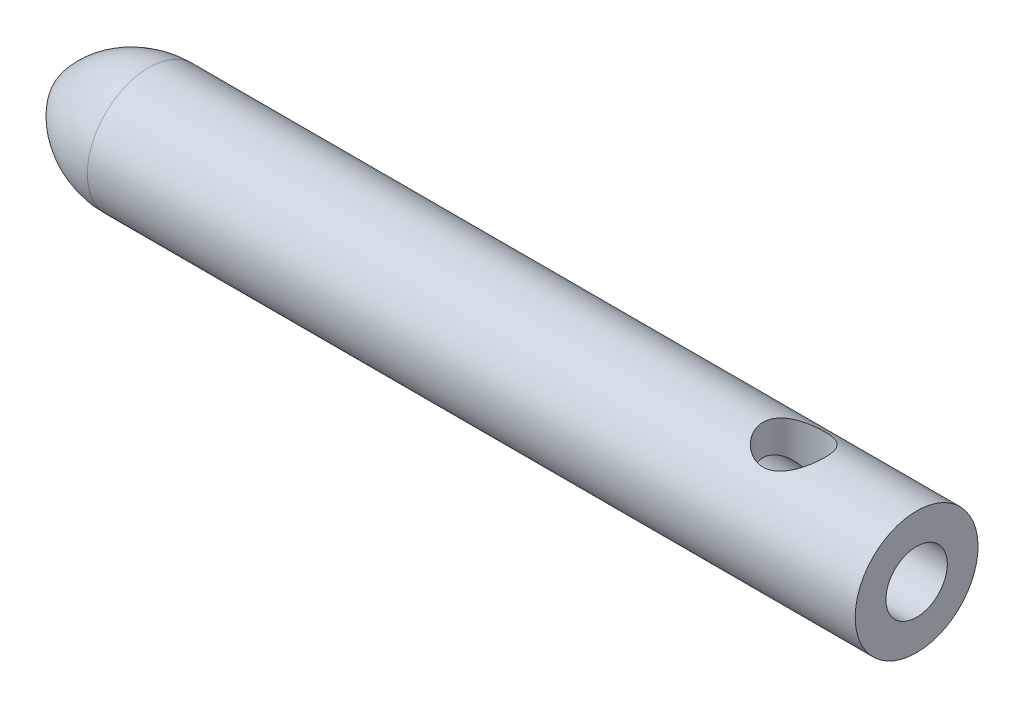
ISO-10303-21;
HEADER;
FILE_DESCRIPTION(('STEP AP214'),'2;1');
FILE_NAME('part.step','',(''),(''),'','','');
FILE_SCHEMA(('AUTOMOTIVE_DESIGN { 1 0 10303 214 1 1 1 1 }'));
ENDSEC;
DATA;
#1=APPLICATION_CONTEXT('core data for automotive mechanical design processes');
#2=APPLICATION_PROTOCOL_DEFINITION('international standard','automotive_design',2000,#1);
#3=PRODUCT_CONTEXT('',#1,'mechanical');
#4=PRODUCT('Part','Part','',(#3));
#5=PRODUCT_RELATED_PRODUCT_CATEGORY('part','',(#4));
#6=PRODUCT_DEFINITION_FORMATION('','',#4);
#7=PRODUCT_DEFINITION_CONTEXT('part definition',#1,'design');
#8=PRODUCT_DEFINITION('design','',#6,#7);
#9=PRODUCT_DEFINITION_SHAPE('','',#8);
#10=(LENGTH_UNIT() NAMED_UNIT(*) SI_UNIT(.MILLI.,.METRE.));
#11=(NAMED_UNIT(*) PLANE_ANGLE_UNIT() SI_UNIT($,.RADIAN.));
#12=(NAMED_UNIT(*) SI_UNIT($,.STERADIAN.) SOLID_ANGLE_UNIT());
#13=UNCERTAINTY_MEASURE_WITH_UNIT(LENGTH_MEASURE(1.E-05),#10,'distance_accuracy_value','');
#14=(GEOMETRIC_REPRESENTATION_CONTEXT(3) GLOBAL_UNCERTAINTY_ASSIGNED_CONTEXT((#13)) GLOBAL_UNIT_ASSIGNED_CONTEXT((#10,
#11,#12)) REPRESENTATION_CONTEXT('',''));
#15=CARTESIAN_POINT('',(0.,0.,0.));
#16=DIRECTION('',(0.,0.,1.));
#17=DIRECTION('',(1.,0.,0.));
#18=AXIS2_PLACEMENT_3D('',#15,#16,#17);
#19=CARTESIAN_POINT('',(0.,0.0846352000332365,0.));
#20=DIRECTION('',(0.,0.,-1.));
#21=DIRECTION('',(0.,-1.,0.));
#22=AXIS2_PLACEMENT_3D('',#19,#20,#21);
#23=CIRCLE('',#22,3.25);
#24=TRIMMED_CURVE('',#23,(PARAMETER_VALUE(-1.17600520709514)),
(PARAMETER_VALUE(1.17600520709514)),.T.,.PARAMETER.);
#25=CARTESIAN_POINT('',(0.,-1.16536479996676,0.));
#26=DIRECTION('',(-1.,0.,0.));
#27=AXIS1_PLACEMENT('',#25,#26);
#28=SURFACE_OF_REVOLUTION('',#24,#27);
#29=CARTESIAN_POINT('',(-3.,-1.16536479996676,0.));
#30=VERTEX_POINT('',#29);
#31=VERTEX_LOOP('',#30);
#32=FACE_BOUND('',#31,.T.);
#33=CARTESIAN_POINT('',(0.,-1.16536479996676,0.));
#34=DIRECTION('',(-1.,0.,0.));
#35=DIRECTION('',(0.,-1.,0.));
#36=AXIS2_PLACEMENT_3D('',#33,#34,#35);
#37=CIRCLE('',#36,2.);
#38=CARTESIAN_POINT('',(0.,-3.16536479996677,0.));
#39=VERTEX_POINT('',#38);
#40=EDGE_CURVE('E63',#39,#39,#37,.T.);
#41=ORIENTED_EDGE('',*,*,#40,.T.);
#42=EDGE_LOOP('',(#41));
#43=FACE_BOUND('',#42,.T.);
#44=ADVANCED_FACE('F32',(#32,#43),#28,.T.);
#45=CARTESIAN_POINT('',(25.,0.83463520003324,0.));
#46=DIRECTION('',(-1.,0.,0.));
#47=DIRECTION('',(0.,-1.,0.));
#48=AXIS2_PLACEMENT_3D('',#45,#46,#47);
#49=PLANE('',#48);
#50=CARTESIAN_POINT('',(25.,-1.16536479996676,0.));
#51=DIRECTION('',(1.,0.,0.));
#52=DIRECTION('',(0.,1.,0.));
#53=AXIS2_PLACEMENT_3D('',#50,#51,#52);
#54=CIRCLE('',#53,1.);
#55=CARTESIAN_POINT('',(25.,-0.16536479996676,0.));
#56=VERTEX_POINT('',#55);
#57=EDGE_CURVE('E96',#56,#56,#54,.T.);
#58=ORIENTED_EDGE('',*,*,#57,.F.);
#59=EDGE_LOOP('',(#58));
#60=FACE_BOUND('',#59,.T.);
#61=CARTESIAN_POINT('',(25.,-1.16536479996676,0.));
#62=DIRECTION('',(-1.,0.,0.));
#63=DIRECTION('',(0.,-1.,0.));
#64=AXIS2_PLACEMENT_3D('',#61,#62,#63);
#65=CIRCLE('',#64,2.);
#66=CARTESIAN_POINT('',(25.,-3.16536479996676,0.));
#67=VERTEX_POINT('',#66);
#68=EDGE_CURVE('E44',#67,#67,#65,.T.);
#69=ORIENTED_EDGE('',*,*,#68,.F.);
#70=EDGE_LOOP('',(#69));
#71=FACE_BOUND('',#70,.T.);
#72=ADVANCED_FACE('F73',(#60,#71),#49,.F.);
#73=CARTESIAN_POINT('',(-3.,-1.16536479996676,0.));
#74=DIRECTION('',(-1.,0.,0.));
#75=DIRECTION('',(0.,-1.,0.));
#76=AXIS2_PLACEMENT_3D('',#73,#74,#75);
#77=CYLINDRICAL_SURFACE('',#76,2.);
#78=CARTESIAN_POINT('',(20.,0.834635200033241,0.));
#79=CARTESIAN_POINT('',(20.0000033023195,0.83463233407475,-0.0525719629529865));
#80=CARTESIAN_POINT('',(20.0041700731217,0.832540110228417,-0.105206599698033));
#81=CARTESIAN_POINT('',(20.0206528803409,0.824376760407203,-0.208920235268425));
#82=CARTESIAN_POINT('',(20.0329843929977,0.818298078323076,-0.259996086713503));
#83=CARTESIAN_POINT('',(20.0651938086168,0.802797994066356,-0.358933544880575));
#84=CARTESIAN_POINT('',(20.085042384248,0.793389591808443,-0.406806802939181));
#85=CARTESIAN_POINT('',(20.1315706213649,0.772092965191026,-0.498472616806567));
#86=CARTESIAN_POINT('',(20.1582497442489,0.76020493636854,-0.542265493990051));
#87=CARTESIAN_POINT('',(20.2195172494853,0.73419778261381,-0.62750781776192));
#88=CARTESIAN_POINT('',(20.2544864792396,0.719987191308598,-0.668655211122113));
#89=CARTESIAN_POINT('',(20.330521479247,0.691234902500683,-0.744779444866979));
#90=CARTESIAN_POINT('',(20.3715918517724,0.67669296212359,-0.779751583106768));
#91=CARTESIAN_POINT('',(20.4624833495234,0.647624712006711,-0.84525200045028));
#92=CARTESIAN_POINT('',(20.5127360983459,0.633187069734559,-0.875225335551638));
#93=CARTESIAN_POINT('',(20.6183673359862,0.607494987756447,-0.926168226890697));
#94=CARTESIAN_POINT('',(20.6737421287228,0.596238276103137,-0.947144214966336));
#95=CARTESIAN_POINT('',(20.7846651054219,0.579213870411325,-0.97813244218859));
#96=CARTESIAN_POINT('',(20.8400044520674,0.573157915870376,-0.988725857080443));
#97=CARTESIAN_POINT('',(20.9519788377795,0.566454099518518,-1.00042699330885));
#98=CARTESIAN_POINT('',(21.0086125408712,0.565800893466121,-1.00154408837308));
#99=CARTESIAN_POINT('',(21.1142860243154,0.569744502605725,-0.994687287172296));
#100=CARTESIAN_POINT('',(21.163424031223,0.573722836653376,-0.987784559536823));
#101=CARTESIAN_POINT('',(21.259721909373,0.585397487371743,-0.966939849056934));
#102=CARTESIAN_POINT('',(21.3068811453053,0.593094988351003,-0.952995623897654));
#103=CARTESIAN_POINT('',(21.3992291325657,0.61150996416065,-0.918209780386006));
#104=CARTESIAN_POINT('',(21.4443463987858,0.622293606673226,-0.897215067115997));
#105=CARTESIAN_POINT('',(21.53063429259,0.645669242847277,-0.849041687668003));
#106=CARTESIAN_POINT('',(21.5718031356001,0.658262047835147,-0.821860243812468));
#107=CARTESIAN_POINT('',(21.6545212527432,0.685766779066099,-0.758066054912789));
#108=CARTESIAN_POINT('',(21.6954568735762,0.700770302400703,-0.720694458369282));
#109=CARTESIAN_POINT('',(21.7707354185909,0.730111433037313,-0.639555578741373));
#110=CARTESIAN_POINT('',(21.8050751920339,0.744448719621249,-0.595785256574286));
#111=CARTESIAN_POINT('',(21.8676856610297,0.771655072862879,-0.50051650583185));
#112=CARTESIAN_POINT('',(21.8956004724457,0.784425041653314,-0.448753591599411));
#113=CARTESIAN_POINT('',(21.942097029043,0.806214011245662,-0.3404662154888));
#114=CARTESIAN_POINT('',(21.9606861850152,0.815235989468767,-0.283945576265279));
#115=CARTESIAN_POINT('',(21.9864754037167,0.827878537447601,-0.172766491660704));
#116=CARTESIAN_POINT('',(21.9944912357468,0.831884583046358,-0.118341530548327));
#117=CARTESIAN_POINT('',(22.0014647311345,0.83536533462426,-0.00877959994935552));
#118=CARTESIAN_POINT('',(22.0004266856395,0.834842187246364,0.0463570198698998));
#119=CARTESIAN_POINT('',(21.9897933115813,0.829547122567649,0.151232971985993));
#120=CARTESIAN_POINT('',(21.98086746727,0.825107656915138,0.201059408049954));
#121=CARTESIAN_POINT('',(21.9557619281049,0.812856913181431,0.298406892301916));
#122=CARTESIAN_POINT('',(21.9395814335466,0.805045263376566,0.345927685690996));
#123=CARTESIAN_POINT('',(21.9000015335668,0.786477714169936,0.438888608449664));
#124=CARTESIAN_POINT('',(21.8764089498832,0.775644017732634,0.484230397006152));
#125=CARTESIAN_POINT('',(21.822892464354,0.752074943204332,0.57046136169892));
#126=CARTESIAN_POINT('',(21.7929658654066,0.739338755691093,0.611348629775281));
#127=CARTESIAN_POINT('',(21.7242395746671,0.711717413407886,0.691767689290652));
#128=CARTESIAN_POINT('',(21.6848571315464,0.696744048517655,0.730772077824637));
#129=CARTESIAN_POINT('',(21.6000748487307,0.667259116071986,0.801856321113238));
#130=CARTESIAN_POINT('',(21.5546708811836,0.652747873848505,0.833931385690841));
#131=CARTESIAN_POINT('',(21.4563563457997,0.625147122293922,0.891707914497696));
#132=CARTESIAN_POINT('',(21.4031887337914,0.612160496667961,0.917025495878637));
#133=CARTESIAN_POINT('',(21.2924899323075,0.590375923714503,0.958082826013803));
#134=CARTESIAN_POINT('',(21.2349644734988,0.581572582439421,0.97383491588757));
#135=CARTESIAN_POINT('',(21.1230897771386,0.570250210119908,0.99386168744968));
#136=CARTESIAN_POINT('',(21.068965746571,0.567209034638152,0.999092996400866));
#137=CARTESIAN_POINT('',(20.9605529328293,0.56628874649499,1.00068915438079));
#138=CARTESIAN_POINT('',(20.9062642312606,0.568407396308766,0.9970578466244));
#139=CARTESIAN_POINT('',(20.804516498468,0.577013820533487,0.981926125592265));
#140=CARTESIAN_POINT('',(20.7568995298556,0.583066144857176,0.971208314342801));
#141=CARTESIAN_POINT('',(20.6641918805753,0.598345361912415,0.943175358224647));
#142=CARTESIAN_POINT('',(20.619102017908,0.607573275729996,0.925858091159812));
#143=CARTESIAN_POINT('',(20.5293751490134,0.628920503678521,0.883815745300685));
#144=CARTESIAN_POINT('',(20.4849720981703,0.641192423995146,0.85867113781646));
#145=CARTESIAN_POINT('',(20.4007254638194,0.666988516379142,0.802150971636637));
#146=CARTESIAN_POINT('',(20.3608842694815,0.68051333797846,0.770772171238652));
#147=CARTESIAN_POINT('',(20.2818580176424,0.70925843162637,0.698203326664645));
#148=CARTESIAN_POINT('',(20.2433408976381,0.724485033147926,0.656284423010174));
#149=CARTESIAN_POINT('',(20.1737370165764,0.753412722584117,0.566154806220283));
#150=CARTESIAN_POINT('',(20.1426542605737,0.767112986113639,0.517940723256789));
#151=CARTESIAN_POINT('',(20.0887636372378,0.791615295884272,0.41593159681995));
#152=CARTESIAN_POINT('',(20.0660158305886,0.802396165662329,0.362099503934617));
#153=CARTESIAN_POINT('',(20.030191832081,0.819648613667895,0.250742101294193));
#154=CARTESIAN_POINT('',(20.0170881531704,0.826132433762561,0.193227799623167));
#155=CARTESIAN_POINT('',(20.0061025889242,0.831589819129873,0.112601946483385));
#156=CARTESIAN_POINT('',(20.0038173591364,0.832728853425256,0.0901618794394991));
#157=CARTESIAN_POINT('',(20.0007653344832,0.834252169811889,0.0451517318071578));
#158=CARTESIAN_POINT('',(19.9999985815288,0.834636431070874,0.0225816476473814));
#159=CARTESIAN_POINT('',(20.,0.834635200033241,0.));
#160=B_SPLINE_CURVE_WITH_KNOTS('',3,(#78,#79,#80,#81,#82,#83,#84,#85,#86,#87,#88,#89,#90,#91,
#92,#93,#94,#95,#96,#97,#98,#99,#100,#101,#102,#103,#104,#105,#106,#107,#108,#109,#110,#111,
#112,#113,#114,#115,#116,#117,#118,#119,#120,#121,#122,#123,#124,#125,#126,#127,#128,#129,#130,
#131,#132,#133,#134,#135,#136,#137,#138,#139,#140,#141,#142,#143,#144,#145,#146,#147,#148,#149,
#150,#151,#152,#153,#154,#155,#156,#157,#158,#159),.UNSPECIFIED.,.T.,.F.,(4,2,2,2,2,2,2,2,2,2,2,
2,2,2,2,2,2,2,2,2,2,2,2,2,2,2,2,2,2,2,2,2,2,2,2,2,2,2,2,2,4),(0.,0.157624257420292,
0.315548149709198,0.472862155492299,0.630163760581569,0.796981758718089,0.963926237654035,
1.14381726430753,1.32357947898281,1.4925801214023,1.6614135732902,1.8100571240932,
1.95874803925678,2.11090240168488,2.26312521260222,2.43464941333879,2.60625534598687,
2.78583022214441,2.9652621691228,3.12983290471346,3.29432564511476,3.44606906506122,
3.59782921630932,3.75392856027899,3.91009450748339,4.08159610644419,4.25321588615432,
4.43314682159674,4.61284511940778,4.77529307498374,4.93767059860006,5.08457930244183,
5.23153528783678,5.38836456775615,5.54527561138958,5.72125242752499,5.89732383376573,
6.07464013662926,6.25144908624931,6.31915280137698,6.38685838514847),.UNSPECIFIED.);
#161=CARTESIAN_POINT('',(20.,0.834635200033241,0.));
#162=VERTEX_POINT('',#161);
#163=EDGE_CURVE('E11',#162,#162,#160,.T.);
#164=ORIENTED_EDGE('',*,*,#163,.T.);
#165=EDGE_LOOP('',(#164));
#166=FACE_BOUND('',#165,.T.);
#167=ORIENTED_EDGE('',*,*,#40,.F.);
#168=EDGE_LOOP('',(#167));
#169=FACE_BOUND('',#168,.T.);
#170=ORIENTED_EDGE('',*,*,#68,.T.);
#171=EDGE_LOOP('',(#170));
#172=FACE_BOUND('',#171,.T.);
#173=ADVANCED_FACE('F71',(#166,#169,#172),#77,.T.);
#174=CARTESIAN_POINT('',(21.,-1.16536479996676,0.));
#175=DIRECTION('',(0.,1.,0.));
#176=DIRECTION('',(-1.,0.,0.));
#177=AXIS2_PLACEMENT_3D('',#174,#175,#176);
#178=CYLINDRICAL_SURFACE('',#177,1.);
#179=CARTESIAN_POINT('',(21.,-1.16536479996676,0.));
#180=DIRECTION('',(-0.707106781186548,0.707106781186547,0.));
#181=DIRECTION('',(0.707106781186547,0.707106781186548,0.));
#182=AXIS2_PLACEMENT_3D('',#179,#180,#181);
#183=ELLIPSE('',#182,1.4142135623731,1.);
#184=CARTESIAN_POINT('',(21.,-1.16536479996676,-1.));
#185=VERTEX_POINT('',#184);
#186=CARTESIAN_POINT('',(21.,-1.16536479996676,1.));
#187=VERTEX_POINT('',#186);
#188=EDGE_CURVE('E56',#185,#187,#183,.F.);
#189=ORIENTED_EDGE('',*,*,#188,.T.);
#190=CARTESIAN_POINT('',(21.,-1.16536479996676,0.));
#191=DIRECTION('',(0.707106781186547,0.707106781186548,0.));
#192=DIRECTION('',(-0.707106781186548,0.707106781186547,0.));
#193=AXIS2_PLACEMENT_3D('',#190,#191,#192);
#194=ELLIPSE('',#193,1.4142135623731,1.);
#195=EDGE_CURVE('E50',#187,#185,#194,.F.);
#196=ORIENTED_EDGE('',*,*,#195,.T.);
#197=EDGE_LOOP('',(#189,#196));
#198=FACE_BOUND('',#197,.T.);
#199=ORIENTED_EDGE('',*,*,#163,.F.);
#200=EDGE_LOOP('',(#199));
#201=FACE_BOUND('',#200,.T.);
#202=ADVANCED_FACE('F61',(#198,#201),#178,.F.);
#203=CARTESIAN_POINT('',(15.,-1.16536479996676,0.));
#204=DIRECTION('',(1.,0.,0.));
#205=DIRECTION('',(0.,1.,0.));
#206=AXIS2_PLACEMENT_3D('',#203,#204,#205);
#207=CYLINDRICAL_SURFACE('',#206,1.);
#208=CARTESIAN_POINT('',(15.,-1.16536479996676,0.));
#209=DIRECTION('',(1.,0.,0.));
#210=DIRECTION('',(0.,1.,0.));
#211=AXIS2_PLACEMENT_3D('',#208,#209,#210);
#212=CIRCLE('',#211,1.);
#213=CARTESIAN_POINT('',(15.,-0.165364799966761,0.));
#214=VERTEX_POINT('',#213);
#215=EDGE_CURVE('E59',#214,#214,#212,.T.);
#216=ORIENTED_EDGE('',*,*,#215,.F.);
#217=EDGE_LOOP('',(#216));
#218=FACE_BOUND('',#217,.T.);
#219=ORIENTED_EDGE('',*,*,#57,.T.);
#220=EDGE_LOOP('',(#219));
#221=FACE_BOUND('',#220,.T.);
#222=ORIENTED_EDGE('',*,*,#188,.F.);
#223=ORIENTED_EDGE('',*,*,#195,.F.);
#224=EDGE_LOOP('',(#222,#223));
#225=FACE_BOUND('',#224,.T.);
#226=ADVANCED_FACE('F57',(#218,#221,#225),#207,.F.);
#227=CARTESIAN_POINT('',(15.,-1.16536479996676,0.));
#228=DIRECTION('',(1.,0.,0.));
#229=DIRECTION('',(0.,1.,0.));
#230=AXIS2_PLACEMENT_3D('',#227,#228,#229);
#231=PLANE('',#230);
#232=ORIENTED_EDGE('',*,*,#215,.T.);
#233=EDGE_LOOP('',(#232));
#234=FACE_BOUND('',#233,.T.);
#235=ADVANCED_FACE('F88',(#234),#231,.T.);
#236=CLOSED_SHELL('',(#44,#72,#173,#202,#226,#235));
#237=MANIFOLD_SOLID_BREP('B2',#236);
#238=ADVANCED_BREP_SHAPE_REPRESENTATION('',(#18,#237),#14);
#239=SHAPE_DEFINITION_REPRESENTATION(#9,#238);
ENDSEC;
END-ISO-10303-21;
